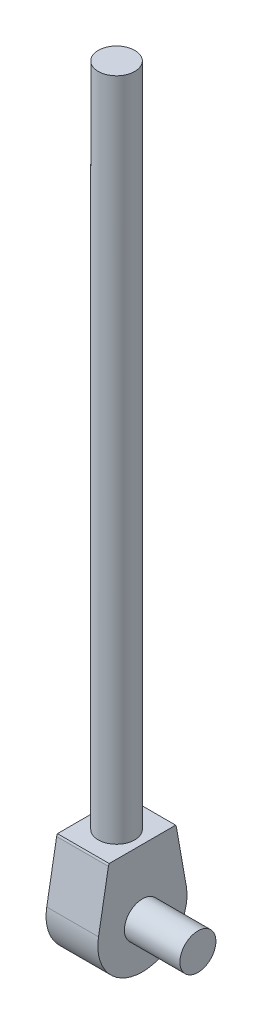
ISO-10303-21;
HEADER;
FILE_DESCRIPTION(('STEP AP214'),'2;1');
FILE_NAME('part.step','',(''),(''),'','','');
FILE_SCHEMA(('AUTOMOTIVE_DESIGN { 1 0 10303 214 1 1 1 1 }'));
ENDSEC;
DATA;
#1=APPLICATION_CONTEXT('core data for automotive mechanical design processes');
#2=APPLICATION_PROTOCOL_DEFINITION('international standard','automotive_design',2000,#1);
#3=PRODUCT_CONTEXT('',#1,'mechanical');
#4=PRODUCT('Part','Part','',(#3));
#5=PRODUCT_RELATED_PRODUCT_CATEGORY('part','',(#4));
#6=PRODUCT_DEFINITION_FORMATION('','',#4);
#7=PRODUCT_DEFINITION_CONTEXT('part definition',#1,'design');
#8=PRODUCT_DEFINITION('design','',#6,#7);
#9=PRODUCT_DEFINITION_SHAPE('','',#8);
#10=(LENGTH_UNIT() NAMED_UNIT(*) SI_UNIT(.MILLI.,.METRE.));
#11=(NAMED_UNIT(*) PLANE_ANGLE_UNIT() SI_UNIT($,.RADIAN.));
#12=(NAMED_UNIT(*) SI_UNIT($,.STERADIAN.) SOLID_ANGLE_UNIT());
#13=UNCERTAINTY_MEASURE_WITH_UNIT(LENGTH_MEASURE(1.E-05),#10,'distance_accuracy_value','');
#14=(GEOMETRIC_REPRESENTATION_CONTEXT(3) GLOBAL_UNCERTAINTY_ASSIGNED_CONTEXT((#13)) GLOBAL_UNIT_ASSIGNED_CONTEXT((#10,
#11,#12)) REPRESENTATION_CONTEXT('',''));
#15=CARTESIAN_POINT('',(0.,0.,0.));
#16=DIRECTION('',(0.,0.,1.));
#17=DIRECTION('',(1.,0.,0.));
#18=AXIS2_PLACEMENT_3D('',#15,#16,#17);
#19=CARTESIAN_POINT('',(28.448,68.197598469496,-30.476750364244));
#20=DIRECTION('',(1.,0.,0.));
#21=DIRECTION('',(0.,0.,-1.));
#22=AXIS2_PLACEMENT_3D('',#19,#20,#21);
#23=PLANE('',#22);
#24=CARTESIAN_POINT('',(28.448,68.197598469496,-30.476750364244));
#25=DIRECTION('',(1.,0.,0.));
#26=DIRECTION('',(0.,0.,-1.));
#27=AXIS2_PLACEMENT_3D('',#24,#25,#26);
#28=CIRCLE('',#27,6.99999342384137);
#29=CARTESIAN_POINT('',(28.448,69.4136344400604,-37.3703100000284));
#30=VERTEX_POINT('',#29);
#31=CARTESIAN_POINT('',(28.448,71.6975986067716,-36.5389205179838));
#32=VERTEX_POINT('',#31);
#33=EDGE_CURVE('E124',#30,#32,#28,.T.);
#34=ORIENTED_EDGE('',*,*,#33,.T.);
#35=DIRECTION('',(0.,-3.33665997890797E-08,0.999999999999999));
#36=VECTOR('',#35,1.);
#37=CARTESIAN_POINT('',(28.448,71.6975986067716,-36.5389205179838));
#38=LINE('',#37,#36);
#39=CARTESIAN_POINT('',(28.448,71.6975961684128,36.5389137108707));
#40=VERTEX_POINT('',#39);
#41=EDGE_CURVE('E91',#32,#40,#38,.T.);
#42=ORIENTED_EDGE('',*,*,#41,.T.);
#43=CARTESIAN_POINT('',(28.448,68.1975940143631,30.4767151086205));
#44=DIRECTION('',(1.,0.,0.));
#45=DIRECTION('',(0.,0.,1.));
#46=AXIS2_PLACEMENT_3D('',#43,#44,#45);
#47=CIRCLE('',#46,7.00001906936523);
#48=CARTESIAN_POINT('',(28.448,69.4136344400604,37.3702999999921));
#49=VERTEX_POINT('',#48);
#50=EDGE_CURVE('E127',#40,#49,#47,.T.);
#51=ORIENTED_EDGE('',*,*,#50,.T.);
#52=DIRECTION('',(0.,-0.984795158850432,0.173719587567873));
#53=VECTOR('',#52,1.);
#54=CARTESIAN_POINT('',(28.448,69.4136344400604,37.3702999999921));
#55=LINE('',#54,#53);
#56=CARTESIAN_POINT('',(28.448,7.7361844400592,48.250309999986));
#57=VERTEX_POINT('',#56);
#58=EDGE_CURVE('E129',#49,#57,#55,.T.);
#59=ORIENTED_EDGE('',*,*,#58,.T.);
#60=CARTESIAN_POINT('',(28.448,-0.775255473600311,-5.00000396641553E-06));
#61=DIRECTION('',(1.,0.,0.));
#62=DIRECTION('',(0.,0.,1.));
#63=AXIS2_PLACEMENT_3D('',#60,#61,#62);
#64=CIRCLE('',#63,48.9952804564082);
#65=CARTESIAN_POINT('',(28.448,7.73618444003764,-48.2503199999978));
#66=VERTEX_POINT('',#65);
#67=EDGE_CURVE('E53',#57,#66,#64,.T.);
#68=ORIENTED_EDGE('',*,*,#67,.T.);
#69=DIRECTION('',(0.,0.98479515885051,0.173719587567433));
#70=VECTOR('',#69,1.);
#71=CARTESIAN_POINT('',(28.448,69.4136344400604,-37.3703100000284));
#72=LINE('',#71,#70);
#73=EDGE_CURVE('E48',#66,#30,#72,.T.);
#74=ORIENTED_EDGE('',*,*,#73,.T.);
#75=EDGE_LOOP('',(#34,#42,#51,#59,#68,#74));
#76=FACE_BOUND('',#75,.T.);
#77=CARTESIAN_POINT('',(28.448,0.,0.));
#78=DIRECTION('',(1.,0.,0.));
#79=DIRECTION('',(0.,0.,-1.));
#80=AXIS2_PLACEMENT_3D('',#77,#78,#79);
#81=CIRCLE('',#80,19.812);
#82=CARTESIAN_POINT('',(28.448,0.,19.812));
#83=VERTEX_POINT('',#82);
#84=EDGE_CURVE('E198',#83,#83,#81,.T.);
#85=ORIENTED_EDGE('',*,*,#84,.F.);
#86=EDGE_LOOP('',(#85));
#87=FACE_BOUND('',#86,.T.);
#88=ADVANCED_FACE('F32',(#76,#87),#23,.T.);
#89=CARTESIAN_POINT('',(28.448,71.6975986067716,-36.5389205179838));
#90=DIRECTION('',(0.,-0.999999999999999,-3.33665997890797E-08));
#91=DIRECTION('',(0.,3.33665997890797E-08,-0.999999999999999));
#92=AXIS2_PLACEMENT_3D('',#89,#90,#91);
#93=PLANE('',#92);
#94=DIRECTION('',(-1.,0.,0.));
#95=VECTOR('',#94,1.);
#96=CARTESIAN_POINT('',(28.448,71.6975986067716,-36.5389205179838));
#97=LINE('',#96,#95);
#98=CARTESIAN_POINT('',(-28.448,71.6975986067716,-36.5389205179838));
#99=VERTEX_POINT('',#98);
#100=EDGE_CURVE('E41',#32,#99,#97,.T.);
#101=ORIENTED_EDGE('',*,*,#100,.T.);
#102=DIRECTION('',(0.,-3.33665997890797E-08,0.999999999999999));
#103=VECTOR('',#102,1.);
#104=CARTESIAN_POINT('',(-28.448,71.6975986067716,-36.5389205179838));
#105=LINE('',#104,#103);
#106=CARTESIAN_POINT('',(-28.448,71.6975961684128,36.5389137108707));
#107=VERTEX_POINT('',#106);
#108=EDGE_CURVE('E90',#99,#107,#105,.T.);
#109=ORIENTED_EDGE('',*,*,#108,.T.);
#110=DIRECTION('',(-1.,0.,0.));
#111=VECTOR('',#110,1.);
#112=CARTESIAN_POINT('',(28.448,71.6975961684128,36.5389137108707));
#113=LINE('',#112,#111);
#114=EDGE_CURVE('E95',#40,#107,#113,.T.);
#115=ORIENTED_EDGE('',*,*,#114,.F.);
#116=ORIENTED_EDGE('',*,*,#41,.F.);
#117=EDGE_LOOP('',(#101,#109,#115,#116));
#118=FACE_BOUND('',#117,.T.);
#119=CARTESIAN_POINT('',(0.,71.697597387592,2.39230503787035E-06));
#120=DIRECTION('',(0.,-0.999999999999999,-3.33665997890797E-08));
#121=DIRECTION('',(0.,3.33665997890797E-08,-0.999999999999999));
#122=AXIS2_PLACEMENT_3D('',#119,#120,#121);
#123=CIRCLE('',#122,20.066);
#124=CARTESIAN_POINT('',(0.,71.6975980571262,-20.065997607695));
#125=VERTEX_POINT('',#124);
#126=EDGE_CURVE('E11',#125,#125,#123,.F.);
#127=ORIENTED_EDGE('',*,*,#126,.F.);
#128=EDGE_LOOP('',(#127));
#129=FACE_BOUND('',#128,.T.);
#130=ADVANCED_FACE('F87',(#118,#129),#93,.F.);
#131=CARTESIAN_POINT('',(28.448,68.197598469496,-30.476750364244));
#132=DIRECTION('',(-1.,0.,0.));
#133=DIRECTION('',(0.,0.,1.));
#134=AXIS2_PLACEMENT_3D('',#131,#132,#133);
#135=CYLINDRICAL_SURFACE('',#134,6.99999342384137);
#136=DIRECTION('',(-1.,0.,0.));
#137=VECTOR('',#136,1.);
#138=CARTESIAN_POINT('',(28.448,69.4136344400604,-37.3703100000284));
#139=LINE('',#138,#137);
#140=CARTESIAN_POINT('',(-28.448,69.4136344400604,-37.3703100000284));
#141=VERTEX_POINT('',#140);
#142=EDGE_CURVE('E108',#30,#141,#139,.T.);
#143=ORIENTED_EDGE('',*,*,#142,.T.);
#144=CARTESIAN_POINT('',(-28.448,68.197598469496,-30.476750364244));
#145=DIRECTION('',(1.,0.,0.));
#146=DIRECTION('',(0.,0.,-1.));
#147=AXIS2_PLACEMENT_3D('',#144,#145,#146);
#148=CIRCLE('',#147,6.99999342384137);
#149=EDGE_CURVE('E102',#141,#99,#148,.T.);
#150=ORIENTED_EDGE('',*,*,#149,.T.);
#151=ORIENTED_EDGE('',*,*,#100,.F.);
#152=ORIENTED_EDGE('',*,*,#33,.F.);
#153=EDGE_LOOP('',(#143,#150,#151,#152));
#154=FACE_BOUND('',#153,.T.);
#155=ADVANCED_FACE('F34',(#154),#135,.T.);
#156=CARTESIAN_POINT('',(28.448,68.1975940143631,30.4767151086205));
#157=DIRECTION('',(-1.,0.,0.));
#158=DIRECTION('',(0.,0.,1.));
#159=AXIS2_PLACEMENT_3D('',#156,#157,#158);
#160=CYLINDRICAL_SURFACE('',#159,7.00001906936523);
#161=ORIENTED_EDGE('',*,*,#114,.T.);
#162=CARTESIAN_POINT('',(-28.448,68.1975940143631,30.4767151086205));
#163=DIRECTION('',(1.,0.,0.));
#164=DIRECTION('',(0.,0.,1.));
#165=AXIS2_PLACEMENT_3D('',#162,#163,#164);
#166=CIRCLE('',#165,7.00001906936523);
#167=CARTESIAN_POINT('',(-28.448,69.4136344400604,37.3702999999921));
#168=VERTEX_POINT('',#167);
#169=EDGE_CURVE('E106',#107,#168,#166,.T.);
#170=ORIENTED_EDGE('',*,*,#169,.T.);
#171=DIRECTION('',(-1.,0.,0.));
#172=VECTOR('',#171,1.);
#173=CARTESIAN_POINT('',(28.448,69.4136344400604,37.3702999999921));
#174=LINE('',#173,#172);
#175=EDGE_CURVE('E138',#49,#168,#174,.T.);
#176=ORIENTED_EDGE('',*,*,#175,.F.);
#177=ORIENTED_EDGE('',*,*,#50,.F.);
#178=EDGE_LOOP('',(#161,#170,#176,#177));
#179=FACE_BOUND('',#178,.T.);
#180=ADVANCED_FACE('F142',(#179),#160,.T.);
#181=CARTESIAN_POINT('',(28.448,69.4136344400604,37.3702999999921));
#182=DIRECTION('',(0.,-0.173719587567873,-0.984795158850432));
#183=DIRECTION('',(0.,0.984795158850432,-0.173719587567873));
#184=AXIS2_PLACEMENT_3D('',#181,#182,#183);
#185=PLANE('',#184);
#186=ORIENTED_EDGE('',*,*,#175,.T.);
#187=DIRECTION('',(0.,-0.984795158850432,0.173719587567873));
#188=VECTOR('',#187,1.);
#189=CARTESIAN_POINT('',(-28.448,69.4136344400604,37.3702999999921));
#190=LINE('',#189,#188);
#191=CARTESIAN_POINT('',(-28.448,7.7361844400592,48.250309999986));
#192=VERTEX_POINT('',#191);
#193=EDGE_CURVE('E116',#168,#192,#190,.T.);
#194=ORIENTED_EDGE('',*,*,#193,.T.);
#195=DIRECTION('',(-1.,0.,0.));
#196=VECTOR('',#195,1.);
#197=CARTESIAN_POINT('',(28.448,7.7361844400592,48.250309999986));
#198=LINE('',#197,#196);
#199=EDGE_CURVE('E136',#57,#192,#198,.T.);
#200=ORIENTED_EDGE('',*,*,#199,.F.);
#201=ORIENTED_EDGE('',*,*,#58,.F.);
#202=EDGE_LOOP('',(#186,#194,#200,#201));
#203=FACE_BOUND('',#202,.T.);
#204=ADVANCED_FACE('F148',(#203),#185,.F.);
#205=CARTESIAN_POINT('',(28.448,-0.775255473600311,-5.00000396641553E-06));
#206=DIRECTION('',(-1.,0.,0.));
#207=DIRECTION('',(0.,0.,1.));
#208=AXIS2_PLACEMENT_3D('',#205,#206,#207);
#209=CYLINDRICAL_SURFACE('',#208,48.9952804564082);
#210=ORIENTED_EDGE('',*,*,#199,.T.);
#211=CARTESIAN_POINT('',(-28.448,-0.775255473600311,-5.00000396641553E-06));
#212=DIRECTION('',(1.,0.,0.));
#213=DIRECTION('',(0.,0.,1.));
#214=AXIS2_PLACEMENT_3D('',#211,#212,#213);
#215=CIRCLE('',#214,48.9952804564082);
#216=CARTESIAN_POINT('',(-28.448,7.73618444003764,-48.2503199999978));
#217=VERTEX_POINT('',#216);
#218=EDGE_CURVE('E119',#192,#217,#215,.T.);
#219=ORIENTED_EDGE('',*,*,#218,.T.);
#220=DIRECTION('',(-1.,0.,0.));
#221=VECTOR('',#220,1.);
#222=CARTESIAN_POINT('',(28.448,7.73618444003764,-48.2503199999978));
#223=LINE('',#222,#221);
#224=EDGE_CURVE('E134',#66,#217,#223,.T.);
#225=ORIENTED_EDGE('',*,*,#224,.F.);
#226=ORIENTED_EDGE('',*,*,#67,.F.);
#227=EDGE_LOOP('',(#210,#219,#225,#226));
#228=FACE_BOUND('',#227,.T.);
#229=ADVANCED_FACE('F151',(#228),#209,.T.);
#230=CARTESIAN_POINT('',(28.448,69.4136344400604,-37.3703100000284));
#231=DIRECTION('',(0.,-0.173719587567433,0.98479515885051));
#232=DIRECTION('',(0.,-0.98479515885051,-0.173719587567433));
#233=AXIS2_PLACEMENT_3D('',#230,#231,#232);
#234=PLANE('',#233);
#235=ORIENTED_EDGE('',*,*,#224,.T.);
#236=DIRECTION('',(0.,0.98479515885051,0.173719587567433));
#237=VECTOR('',#236,1.);
#238=CARTESIAN_POINT('',(-28.448,69.4136344400604,-37.3703100000284));
#239=LINE('',#238,#237);
#240=EDGE_CURVE('E122',#217,#141,#239,.T.);
#241=ORIENTED_EDGE('',*,*,#240,.T.);
#242=ORIENTED_EDGE('',*,*,#142,.F.);
#243=ORIENTED_EDGE('',*,*,#73,.F.);
#244=EDGE_LOOP('',(#235,#241,#242,#243));
#245=FACE_BOUND('',#244,.T.);
#246=ADVANCED_FACE('F153',(#245),#234,.F.);
#247=CARTESIAN_POINT('',(-28.448,68.197598469496,-30.476750364244));
#248=DIRECTION('',(1.,0.,0.));
#249=DIRECTION('',(0.,0.,-1.));
#250=AXIS2_PLACEMENT_3D('',#247,#248,#249);
#251=PLANE('',#250);
#252=CARTESIAN_POINT('',(-28.448,0.,0.));
#253=DIRECTION('',(1.,0.,0.));
#254=DIRECTION('',(0.,0.,-1.));
#255=AXIS2_PLACEMENT_3D('',#252,#253,#254);
#256=CIRCLE('',#255,34.1737826455291);
#257=CARTESIAN_POINT('',(-28.448,0.,-34.1737826455291));
#258=VERTEX_POINT('',#257);
#259=EDGE_CURVE('E36',#258,#258,#256,.T.);
#260=ORIENTED_EDGE('',*,*,#259,.T.);
#261=EDGE_LOOP('',(#260));
#262=FACE_BOUND('',#261,.T.);
#263=ORIENTED_EDGE('',*,*,#149,.F.);
#264=ORIENTED_EDGE('',*,*,#240,.F.);
#265=ORIENTED_EDGE('',*,*,#218,.F.);
#266=ORIENTED_EDGE('',*,*,#193,.F.);
#267=ORIENTED_EDGE('',*,*,#169,.F.);
#268=ORIENTED_EDGE('',*,*,#108,.F.);
#269=EDGE_LOOP('',(#263,#264,#265,#266,#267,#268));
#270=FACE_BOUND('',#269,.T.);
#271=ADVANCED_FACE('F100',(#262,#270),#251,.F.);
#272=CARTESIAN_POINT('',(0.,803.090597387592,2.67964025574047E-05));
#273=DIRECTION('',(0.,-0.999999999999999,-3.33665997890797E-08));
#274=DIRECTION('',(0.,3.33665997890797E-08,-1.));
#275=AXIS2_PLACEMENT_3D('',#272,#273,#274);
#276=CYLINDRICAL_SURFACE('',#275,20.066);
#277=CARTESIAN_POINT('',(0.,803.090597387592,2.67964025574047E-05));
#278=DIRECTION('',(0.,1.,3.33665997890797E-08));
#279=DIRECTION('',(0.,-3.33665997890797E-08,1.));
#280=AXIS2_PLACEMENT_3D('',#277,#278,#279);
#281=CIRCLE('',#280,20.066);
#282=CARTESIAN_POINT('',(0.,803.090596718057,20.0660267964026));
#283=VERTEX_POINT('',#282);
#284=EDGE_CURVE('E109',#283,#283,#281,.T.);
#285=ORIENTED_EDGE('',*,*,#284,.F.);
#286=EDGE_LOOP('',(#285));
#287=FACE_BOUND('',#286,.T.);
#288=ORIENTED_EDGE('',*,*,#126,.T.);
#289=EDGE_LOOP('',(#288));
#290=FACE_BOUND('',#289,.T.);
#291=ADVANCED_FACE('F160',(#287,#290),#276,.T.);
#292=CARTESIAN_POINT('',(0.,803.090597387592,2.67964025574047E-05));
#293=DIRECTION('',(0.,1.,3.33665997890797E-08));
#294=DIRECTION('',(0.,-3.33665997890797E-08,1.));
#295=AXIS2_PLACEMENT_3D('',#292,#293,#294);
#296=PLANE('',#295);
#297=ORIENTED_EDGE('',*,*,#284,.T.);
#298=EDGE_LOOP('',(#297));
#299=FACE_BOUND('',#298,.T.);
#300=ADVANCED_FACE('F172',(#299),#296,.T.);
#301=CARTESIAN_POINT('',(-32.512,0.,0.));
#302=DIRECTION('',(1.,0.,0.));
#303=DIRECTION('',(0.,0.,-1.));
#304=AXIS2_PLACEMENT_3D('',#301,#302,#303);
#305=CYLINDRICAL_SURFACE('',#304,34.1737826455291);
#306=CARTESIAN_POINT('',(-32.512,0.,0.));
#307=DIRECTION('',(1.,0.,0.));
#308=DIRECTION('',(0.,0.,-1.));
#309=AXIS2_PLACEMENT_3D('',#306,#307,#308);
#310=CIRCLE('',#309,34.1737826455291);
#311=CARTESIAN_POINT('',(-32.512,0.,-34.1737826455291));
#312=VERTEX_POINT('',#311);
#313=EDGE_CURVE('E197',#312,#312,#310,.T.);
#314=CARTESIAN_POINT('',(-32.512,0.,-34.1737826455291));
#315=CARTESIAN_POINT('',(-32.4696666666666,0.,-34.1737826455291));
#316=CARTESIAN_POINT('',(-32.4273333333333,0.,-34.1737826455291));
#317=CARTESIAN_POINT('',(-32.3426666666667,0.,-34.1737826455291));
#318=CARTESIAN_POINT('',(-32.3003333333333,0.,-34.1737826455291));
#319=CARTESIAN_POINT('',(-32.2156666666666,0.,-34.1737826455291));
#320=CARTESIAN_POINT('',(-32.1733333333333,0.,-34.1737826455291));
#321=CARTESIAN_POINT('',(-32.0886666666667,0.,-34.1737826455291));
#322=CARTESIAN_POINT('',(-32.0463333333333,0.,-34.1737826455291));
#323=CARTESIAN_POINT('',(-31.9616666666667,0.,-34.1737826455291));
#324=CARTESIAN_POINT('',(-31.9193333333333,0.,-34.1737826455291));
#325=CARTESIAN_POINT('',(-31.8346666666667,0.,-34.1737826455291));
#326=CARTESIAN_POINT('',(-31.7923333333333,0.,-34.1737826455291));
#327=CARTESIAN_POINT('',(-31.7076666666667,0.,-34.1737826455291));
#328=CARTESIAN_POINT('',(-31.6653333333333,0.,-34.1737826455291));
#329=CARTESIAN_POINT('',(-31.5806666666667,0.,-34.1737826455291));
#330=CARTESIAN_POINT('',(-31.5383333333333,0.,-34.1737826455291));
#331=CARTESIAN_POINT('',(-31.4536666666667,0.,-34.1737826455291));
#332=CARTESIAN_POINT('',(-31.4113333333333,0.,-34.1737826455291));
#333=CARTESIAN_POINT('',(-31.3266666666667,0.,-34.1737826455291));
#334=CARTESIAN_POINT('',(-31.2843333333333,0.,-34.1737826455291));
#335=CARTESIAN_POINT('',(-31.1996666666667,0.,-34.1737826455291));
#336=CARTESIAN_POINT('',(-31.1573333333333,0.,-34.1737826455291));
#337=CARTESIAN_POINT('',(-31.0726666666667,0.,-34.1737826455291));
#338=CARTESIAN_POINT('',(-31.0303333333333,0.,-34.1737826455291));
#339=CARTESIAN_POINT('',(-30.9456666666667,0.,-34.1737826455291));
#340=CARTESIAN_POINT('',(-30.9033333333333,0.,-34.1737826455291));
#341=CARTESIAN_POINT('',(-30.8186666666667,0.,-34.1737826455291));
#342=CARTESIAN_POINT('',(-30.7763333333333,0.,-34.1737826455291));
#343=CARTESIAN_POINT('',(-30.6916666666667,0.,-34.1737826455291));
#344=CARTESIAN_POINT('',(-30.6493333333333,0.,-34.1737826455291));
#345=CARTESIAN_POINT('',(-30.5646666666667,0.,-34.1737826455291));
#346=CARTESIAN_POINT('',(-30.5223333333333,0.,-34.1737826455291));
#347=CARTESIAN_POINT('',(-30.4376666666667,0.,-34.1737826455291));
#348=CARTESIAN_POINT('',(-30.3953333333333,0.,-34.1737826455291));
#349=CARTESIAN_POINT('',(-30.3106666666667,0.,-34.1737826455291));
#350=CARTESIAN_POINT('',(-30.2683333333333,0.,-34.1737826455291));
#351=CARTESIAN_POINT('',(-30.1836666666667,0.,-34.1737826455291));
#352=CARTESIAN_POINT('',(-30.1413333333333,0.,-34.1737826455291));
#353=CARTESIAN_POINT('',(-30.0566666666667,0.,-34.1737826455291));
#354=CARTESIAN_POINT('',(-30.0143333333333,0.,-34.1737826455291));
#355=CARTESIAN_POINT('',(-29.9296666666667,0.,-34.1737826455291));
#356=CARTESIAN_POINT('',(-29.8873333333333,0.,-34.1737826455291));
#357=CARTESIAN_POINT('',(-29.8026666666667,0.,-34.1737826455291));
#358=CARTESIAN_POINT('',(-29.7603333333333,0.,-34.1737826455291));
#359=CARTESIAN_POINT('',(-29.6756666666667,0.,-34.1737826455291));
#360=CARTESIAN_POINT('',(-29.6333333333333,0.,-34.1737826455291));
#361=CARTESIAN_POINT('',(-29.5486666666667,0.,-34.1737826455291));
#362=CARTESIAN_POINT('',(-29.5063333333333,0.,-34.1737826455291));
#363=CARTESIAN_POINT('',(-29.4216666666667,0.,-34.1737826455291));
#364=CARTESIAN_POINT('',(-29.3793333333333,0.,-34.1737826455291));
#365=CARTESIAN_POINT('',(-29.2946666666667,0.,-34.1737826455291));
#366=CARTESIAN_POINT('',(-29.2523333333333,0.,-34.1737826455291));
#367=CARTESIAN_POINT('',(-29.1676666666667,0.,-34.1737826455291));
#368=CARTESIAN_POINT('',(-29.1253333333333,0.,-34.1737826455291));
#369=CARTESIAN_POINT('',(-29.0406666666667,0.,-34.1737826455291));
#370=CARTESIAN_POINT('',(-28.9983333333333,0.,-34.1737826455291));
#371=CARTESIAN_POINT('',(-28.9136666666667,0.,-34.1737826455291));
#372=CARTESIAN_POINT('',(-28.8713333333333,0.,-34.1737826455291));
#373=CARTESIAN_POINT('',(-28.7866666666667,0.,-34.1737826455291));
#374=CARTESIAN_POINT('',(-28.7443333333333,0.,-34.1737826455291));
#375=CARTESIAN_POINT('',(-28.6596666666667,0.,-34.1737826455291));
#376=CARTESIAN_POINT('',(-28.6173333333333,0.,-34.1737826455291));
#377=CARTESIAN_POINT('',(-28.5326666666667,0.,-34.1737826455291));
#378=CARTESIAN_POINT('',(-28.4903333333333,0.,-34.1737826455291));
#379=CARTESIAN_POINT('',(-28.448,0.,-34.1737826455291));
#380=B_SPLINE_CURVE_WITH_KNOTS('',3,(#314,#315,#316,#317,#318,#319,#320,#321,#322,#323,#324,
#325,#326,#327,#328,#329,#330,#331,#332,#333,#334,#335,#336,#337,#338,#339,#340,#341,#342,#343,
#344,#345,#346,#347,#348,#349,#350,#351,#352,#353,#354,#355,#356,#357,#358,#359,#360,#361,#362,
#363,#364,#365,#366,#367,#368,#369,#370,#371,#372,#373,#374,#375,#376,#377,#378,#379),
.UNSPECIFIED.,.F.,.F.,(4,2,2,2,2,2,2,2,2,2,2,2,2,2,2,2,2,2,2,2,2,2,2,2,2,2,2,2,2,2,2,2,4),(0.,
0.126999999999995,0.253999999999997,0.380999999999992,0.507999999999995,0.63499999999999,
0.761999999999992,0.888999999999994,1.01599999999999,1.14299999999999,1.26999999999999,
1.39699999999999,1.52399999999999,1.65099999999999,1.77799999999999,1.90499999999999,
2.03199999999999,2.15899999999998,2.28599999999998,2.41299999999998,2.53999999999998,
2.66699999999998,2.79399999999998,2.92099999999998,3.04799999999998,3.17499999999998,
3.30199999999998,3.42899999999998,3.55599999999998,3.68299999999998,3.80999999999998,
3.93699999999998,4.06399999999997),.UNSPECIFIED.);
#381=EDGE_CURVE('BSEAM176',#312,#258,#380,.T.);
#382=ORIENTED_EDGE('',*,*,#313,.T.);
#383=ORIENTED_EDGE('',*,*,#259,.F.);
#384=ORIENTED_EDGE('',*,*,#381,.T.);
#385=ORIENTED_EDGE('',*,*,#381,.F.);
#386=EDGE_LOOP('',(#382,#384,#383,#385));
#387=FACE_BOUND('',#386,.T.);
#388=ADVANCED_FACE('F176',(#387),#305,.T.);
#389=CARTESIAN_POINT('',(-32.512,0.,0.));
#390=DIRECTION('',(1.,0.,0.));
#391=DIRECTION('',(0.,0.,-1.));
#392=AXIS2_PLACEMENT_3D('',#389,#390,#391);
#393=PLANE('',#392);
#394=ORIENTED_EDGE('',*,*,#313,.F.);
#395=EDGE_LOOP('',(#394));
#396=FACE_BOUND('',#395,.T.);
#397=ADVANCED_FACE('F180',(#396),#393,.F.);
#398=CARTESIAN_POINT('',(89.408,0.,0.));
#399=DIRECTION('',(-1.,0.,0.));
#400=DIRECTION('',(0.,0.,1.));
#401=AXIS2_PLACEMENT_3D('',#398,#399,#400);
#402=CYLINDRICAL_SURFACE('',#401,19.812);
#403=CARTESIAN_POINT('',(89.408,0.,0.));
#404=DIRECTION('',(1.,0.,0.));
#405=DIRECTION('',(0.,0.,-1.));
#406=AXIS2_PLACEMENT_3D('',#403,#404,#405);
#407=CIRCLE('',#406,19.812);
#408=CARTESIAN_POINT('',(89.408,0.,19.812));
#409=VERTEX_POINT('',#408);
#410=EDGE_CURVE('E196',#409,#409,#407,.T.);
#411=CARTESIAN_POINT('',(89.408,0.,19.812));
#412=CARTESIAN_POINT('',(88.773,0.,19.812));
#413=CARTESIAN_POINT('',(88.138,0.,19.812));
#414=CARTESIAN_POINT('',(86.868,0.,19.812));
#415=CARTESIAN_POINT('',(86.233,0.,19.812));
#416=CARTESIAN_POINT('',(84.963,0.,19.812));
#417=CARTESIAN_POINT('',(84.328,0.,19.812));
#418=CARTESIAN_POINT('',(83.058,0.,19.812));
#419=CARTESIAN_POINT('',(82.423,0.,19.812));
#420=CARTESIAN_POINT('',(81.153,0.,19.812));
#421=CARTESIAN_POINT('',(80.518,0.,19.812));
#422=CARTESIAN_POINT('',(79.248,0.,19.812));
#423=CARTESIAN_POINT('',(78.613,0.,19.812));
#424=CARTESIAN_POINT('',(77.343,0.,19.812));
#425=CARTESIAN_POINT('',(76.708,0.,19.812));
#426=CARTESIAN_POINT('',(75.438,0.,19.812));
#427=CARTESIAN_POINT('',(74.803,0.,19.812));
#428=CARTESIAN_POINT('',(73.533,0.,19.812));
#429=CARTESIAN_POINT('',(72.898,0.,19.812));
#430=CARTESIAN_POINT('',(71.628,0.,19.812));
#431=CARTESIAN_POINT('',(70.993,0.,19.812));
#432=CARTESIAN_POINT('',(69.723,0.,19.812));
#433=CARTESIAN_POINT('',(69.088,0.,19.812));
#434=CARTESIAN_POINT('',(67.818,0.,19.812));
#435=CARTESIAN_POINT('',(67.183,0.,19.812));
#436=CARTESIAN_POINT('',(65.913,0.,19.812));
#437=CARTESIAN_POINT('',(65.278,0.,19.812));
#438=CARTESIAN_POINT('',(64.008,0.,19.812));
#439=CARTESIAN_POINT('',(63.373,0.,19.812));
#440=CARTESIAN_POINT('',(62.103,0.,19.812));
#441=CARTESIAN_POINT('',(61.468,0.,19.812));
#442=CARTESIAN_POINT('',(60.198,0.,19.812));
#443=CARTESIAN_POINT('',(59.563,0.,19.812));
#444=CARTESIAN_POINT('',(58.293,0.,19.812));
#445=CARTESIAN_POINT('',(57.658,0.,19.812));
#446=CARTESIAN_POINT('',(56.388,0.,19.812));
#447=CARTESIAN_POINT('',(55.753,0.,19.812));
#448=CARTESIAN_POINT('',(54.483,0.,19.812));
#449=CARTESIAN_POINT('',(53.848,0.,19.812));
#450=CARTESIAN_POINT('',(52.578,0.,19.812));
#451=CARTESIAN_POINT('',(51.943,0.,19.812));
#452=CARTESIAN_POINT('',(50.673,0.,19.812));
#453=CARTESIAN_POINT('',(50.038,0.,19.812));
#454=CARTESIAN_POINT('',(48.768,0.,19.812));
#455=CARTESIAN_POINT('',(48.133,0.,19.812));
#456=CARTESIAN_POINT('',(46.863,0.,19.812));
#457=CARTESIAN_POINT('',(46.228,0.,19.812));
#458=CARTESIAN_POINT('',(44.958,0.,19.812));
#459=CARTESIAN_POINT('',(44.323,0.,19.812));
#460=CARTESIAN_POINT('',(43.053,0.,19.812));
#461=CARTESIAN_POINT('',(42.418,0.,19.812));
#462=CARTESIAN_POINT('',(41.148,0.,19.812));
#463=CARTESIAN_POINT('',(40.513,0.,19.812));
#464=CARTESIAN_POINT('',(39.243,0.,19.812));
#465=CARTESIAN_POINT('',(38.608,0.,19.812));
#466=CARTESIAN_POINT('',(37.338,0.,19.812));
#467=CARTESIAN_POINT('',(36.703,0.,19.812));
#468=CARTESIAN_POINT('',(35.433,0.,19.812));
#469=CARTESIAN_POINT('',(34.798,0.,19.812));
#470=CARTESIAN_POINT('',(33.528,0.,19.812));
#471=CARTESIAN_POINT('',(32.893,0.,19.812));
#472=CARTESIAN_POINT('',(31.623,0.,19.812));
#473=CARTESIAN_POINT('',(30.988,0.,19.812));
#474=CARTESIAN_POINT('',(29.718,0.,19.812));
#475=CARTESIAN_POINT('',(29.083,0.,19.812));
#476=CARTESIAN_POINT('',(28.448,0.,19.812));
#477=B_SPLINE_CURVE_WITH_KNOTS('',3,(#411,#412,#413,#414,#415,#416,#417,#418,#419,#420,#421,
#422,#423,#424,#425,#426,#427,#428,#429,#430,#431,#432,#433,#434,#435,#436,#437,#438,#439,#440,
#441,#442,#443,#444,#445,#446,#447,#448,#449,#450,#451,#452,#453,#454,#455,#456,#457,#458,#459,
#460,#461,#462,#463,#464,#465,#466,#467,#468,#469,#470,#471,#472,#473,#474,#475,#476),
.UNSPECIFIED.,.F.,.F.,(4,2,2,2,2,2,2,2,2,2,2,2,2,2,2,2,2,2,2,2,2,2,2,2,2,2,2,2,2,2,2,2,4),(0.,
1.90499999999999,3.80999999999999,5.715,7.61999999999999,9.52499999999999,11.43,13.335,15.24,
17.145,19.05,20.955,22.86,24.765,26.67,28.575,30.48,32.385,34.29,36.195,38.1,40.005,41.91,
43.815,45.72,47.625,49.53,51.435,53.34,55.245,57.15,59.055,60.96),.UNSPECIFIED.);
#478=EDGE_CURVE('BSEAM184',#409,#83,#477,.T.);
#479=ORIENTED_EDGE('',*,*,#410,.F.);
#480=ORIENTED_EDGE('',*,*,#84,.T.);
#481=ORIENTED_EDGE('',*,*,#478,.T.);
#482=ORIENTED_EDGE('',*,*,#478,.F.);
#483=EDGE_LOOP('',(#479,#481,#480,#482));
#484=FACE_BOUND('',#483,.T.);
#485=ADVANCED_FACE('F184',(#484),#402,.T.);
#486=CARTESIAN_POINT('',(89.408,0.,0.));
#487=DIRECTION('',(1.,0.,0.));
#488=DIRECTION('',(0.,0.,-1.));
#489=AXIS2_PLACEMENT_3D('',#486,#487,#488);
#490=PLANE('',#489);
#491=ORIENTED_EDGE('',*,*,#410,.T.);
#492=EDGE_LOOP('',(#491));
#493=FACE_BOUND('',#492,.T.);
#494=ADVANCED_FACE('F188',(#493),#490,.T.);
#495=CLOSED_SHELL('',(#88,#130,#155,#180,#204,#229,#246,#271,#291,#300,#388,#397,#485,#494));
#496=MANIFOLD_SOLID_BREP('B2',#495);
#497=ADVANCED_BREP_SHAPE_REPRESENTATION('',(#18,#496),#14);
#498=SHAPE_DEFINITION_REPRESENTATION(#9,#497);
ENDSEC;
END-ISO-10303-21;
